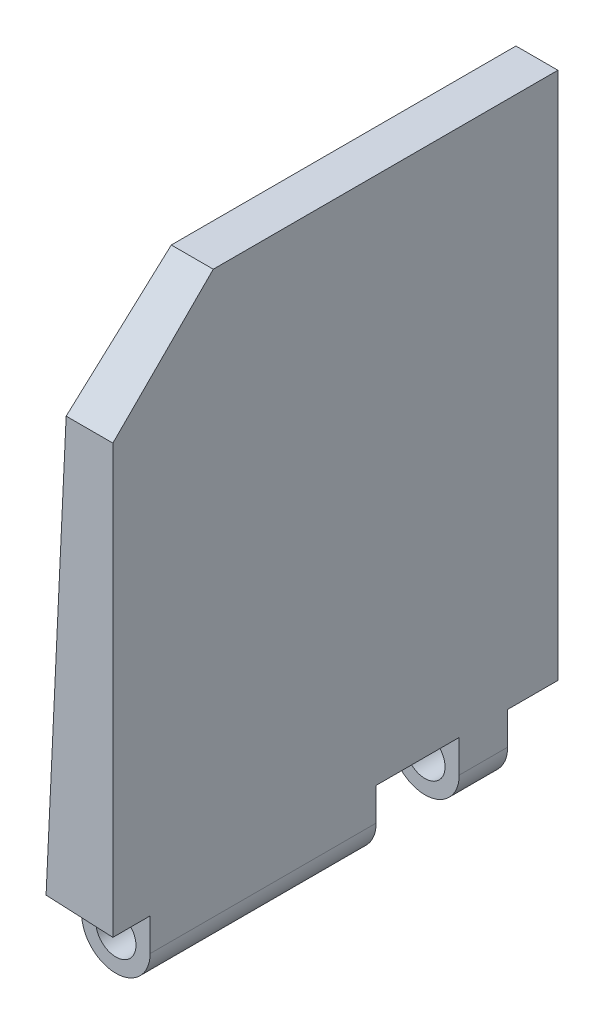
ISO-10303-21;
HEADER;
FILE_DESCRIPTION(('STEP AP214'),'2;1');
FILE_NAME('part.step','',(''),(''),'','','');
FILE_SCHEMA(('AUTOMOTIVE_DESIGN { 1 0 10303 214 1 1 1 1 }'));
ENDSEC;
DATA;
#1=APPLICATION_CONTEXT('core data for automotive mechanical design processes');
#2=APPLICATION_PROTOCOL_DEFINITION('international standard','automotive_design',2000,#1);
#3=PRODUCT_CONTEXT('',#1,'mechanical');
#4=PRODUCT('Part','Part','',(#3));
#5=PRODUCT_RELATED_PRODUCT_CATEGORY('part','',(#4));
#6=PRODUCT_DEFINITION_FORMATION('','',#4);
#7=PRODUCT_DEFINITION_CONTEXT('part definition',#1,'design');
#8=PRODUCT_DEFINITION('design','',#6,#7);
#9=PRODUCT_DEFINITION_SHAPE('','',#8);
#10=(LENGTH_UNIT() NAMED_UNIT(*) SI_UNIT(.MILLI.,.METRE.));
#11=(NAMED_UNIT(*) PLANE_ANGLE_UNIT() SI_UNIT($,.RADIAN.));
#12=(NAMED_UNIT(*) SI_UNIT($,.STERADIAN.) SOLID_ANGLE_UNIT());
#13=UNCERTAINTY_MEASURE_WITH_UNIT(LENGTH_MEASURE(1.E-05),#10,'distance_accuracy_value','');
#14=(GEOMETRIC_REPRESENTATION_CONTEXT(3) GLOBAL_UNCERTAINTY_ASSIGNED_CONTEXT((#13)) GLOBAL_UNIT_ASSIGNED_CONTEXT((#10,
#11,#12)) REPRESENTATION_CONTEXT('',''));
#15=CARTESIAN_POINT('',(0.,0.,0.));
#16=DIRECTION('',(0.,0.,1.));
#17=DIRECTION('',(1.,0.,0.));
#18=AXIS2_PLACEMENT_3D('',#15,#16,#17);
#19=CARTESIAN_POINT('',(-5.9368100641537,148.296821956492,-22.52));
#20=DIRECTION('',(0.,0.,1.));
#21=DIRECTION('',(1.,0.,0.));
#22=AXIS2_PLACEMENT_3D('',#19,#20,#21);
#23=CYLINDRICAL_SURFACE('',#22,1.73219883235693);
#24=CARTESIAN_POINT('',(-5.9368100641537,148.296821956492,-13.3230511202348));
#25=DIRECTION('',(0.,0.,1.));
#26=DIRECTION('',(1.,0.,0.));
#27=AXIS2_PLACEMENT_3D('',#24,#25,#26);
#28=CIRCLE('',#27,1.73219883235693);
#29=CARTESIAN_POINT('',(-4.20461123179677,148.296821956492,-13.3230511202348));
#30=VERTEX_POINT('',#29);
#31=CARTESIAN_POINT('',(-7.66707712949073,148.378606291354,-13.3230511202348));
#32=VERTEX_POINT('',#31);
#33=EDGE_CURVE('E165',#30,#32,#28,.F.);
#34=ORIENTED_EDGE('',*,*,#33,.F.);
#35=DIRECTION('',(0.,0.,1.));
#36=VECTOR('',#35,1.);
#37=CARTESIAN_POINT('',(-4.20461123179677,148.296821956492,-22.52));
#38=LINE('',#37,#36);
#39=CARTESIAN_POINT('',(-4.20461123179677,148.296821956492,-1.88465948900609));
#40=VERTEX_POINT('',#39);
#41=EDGE_CURVE('E192',#30,#40,#38,.T.);
#42=ORIENTED_EDGE('',*,*,#41,.T.);
#43=CARTESIAN_POINT('',(-5.9368100641537,148.296821956492,-1.88465948900609));
#44=DIRECTION('',(0.,0.,-1.));
#45=DIRECTION('',(0.,1.,0.));
#46=AXIS2_PLACEMENT_3D('',#43,#44,#45);
#47=CIRCLE('',#46,1.73219883235693);
#48=CARTESIAN_POINT('',(-7.66707712949073,148.378606291354,-1.88465948900609));
#49=VERTEX_POINT('',#48);
#50=EDGE_CURVE('E181',#49,#40,#47,.F.);
#51=ORIENTED_EDGE('',*,*,#50,.F.);
#52=DIRECTION('',(0.,0.,1.));
#53=VECTOR('',#52,1.);
#54=CARTESIAN_POINT('',(-7.66707712949072,148.378606291354,-22.52));
#55=LINE('',#54,#53);
#56=EDGE_CURVE('E199',#32,#49,#55,.T.);
#57=ORIENTED_EDGE('',*,*,#56,.F.);
#58=EDGE_LOOP('',(#34,#42,#51,#57));
#59=FACE_BOUND('',#58,.T.);
#60=ADVANCED_FACE('F32',(#59),#23,.T.);
#61=CARTESIAN_POINT('',(-5.9368100641537,148.296821956492,-19.9768142277735));
#62=DIRECTION('',(0.,0.,1.));
#63=DIRECTION('',(1.,0.,0.));
#64=AXIS2_PLACEMENT_3D('',#61,#62,#63);
#65=CIRCLE('',#64,1.73219883235693);
#66=CARTESIAN_POINT('',(-4.20461123179677,148.296821956492,-19.9768142277735));
#67=VERTEX_POINT('',#66);
#68=CARTESIAN_POINT('',(-7.66707712949073,148.378606291354,-19.9768142277735));
#69=VERTEX_POINT('',#68);
#70=EDGE_CURVE('E140',#67,#69,#65,.F.);
#71=ORIENTED_EDGE('',*,*,#70,.F.);
#72=CARTESIAN_POINT('',(-4.20461123179677,148.296821956492,-17.5249092704821));
#73=VERTEX_POINT('',#72);
#74=EDGE_CURVE('E204',#67,#73,#38,.T.);
#75=ORIENTED_EDGE('',*,*,#74,.T.);
#76=CARTESIAN_POINT('',(-5.9368100641537,148.296821956492,-17.5249092704821));
#77=DIRECTION('',(0.,0.,-1.));
#78=DIRECTION('',(-1.,0.,0.));
#79=AXIS2_PLACEMENT_3D('',#76,#77,#78);
#80=CIRCLE('',#79,1.73219883235693);
#81=CARTESIAN_POINT('',(-7.66707712949073,148.378606291354,-17.5249092704821));
#82=VERTEX_POINT('',#81);
#83=EDGE_CURVE('E168',#82,#73,#80,.F.);
#84=ORIENTED_EDGE('',*,*,#83,.F.);
#85=EDGE_CURVE('E196',#69,#82,#55,.T.);
#86=ORIENTED_EDGE('',*,*,#85,.F.);
#87=EDGE_LOOP('',(#71,#75,#84,#86));
#88=FACE_BOUND('',#87,.T.);
#89=ADVANCED_FACE('F255',(#88),#23,.T.);
#90=CARTESIAN_POINT('',(-7.66707712949072,148.378606291354,-22.52));
#91=DIRECTION('',(-0.998884789099364,0.0472141727230132,0.));
#92=DIRECTION('',(-0.0472141727230132,-0.998884789099364,0.));
#93=AXIS2_PLACEMENT_3D('',#90,#91,#92);
#94=PLANE('',#93);
#95=DIRECTION('',(-0.0472141727230132,-0.998884789099364,0.));
#96=VECTOR('',#95,1.);
#97=CARTESIAN_POINT('',(-7.66707712949072,148.378606291354,0.));
#98=LINE('',#97,#96);
#99=CARTESIAN_POINT('',(-6.56899797373491,171.610074781681,0.));
#100=VERTEX_POINT('',#99);
#101=CARTESIAN_POINT('',(-7.58529279462923,150.108873356691,0.));
#102=VERTEX_POINT('',#101);
#103=EDGE_CURVE('E188',#100,#102,#98,.T.);
#104=ORIENTED_EDGE('',*,*,#103,.F.);
#105=DIRECTION('',(0.0334040828032297,0.706712164622935,-0.70671216462294));
#106=VECTOR('',#105,1.);
#107=CARTESIAN_POINT('',(-6.58701893405534,171.228815043114,0.381259738567157));
#108=LINE('',#107,#106);
#109=CARTESIAN_POINT('',(-6.3288821965699,176.690074781681,-5.08000000000001));
#110=VERTEX_POINT('',#109);
#111=EDGE_CURVE('E54',#100,#110,#108,.T.);
#112=ORIENTED_EDGE('',*,*,#111,.T.);
#113=DIRECTION('',(0.,0.,1.));
#114=VECTOR('',#113,1.);
#115=CARTESIAN_POINT('',(-6.3288821965699,176.690074781681,-22.52));
#116=LINE('',#115,#114);
#117=CARTESIAN_POINT('',(-6.3288821965699,176.690074781681,-22.52));
#118=VERTEX_POINT('',#117);
#119=EDGE_CURVE('E200',#118,#110,#116,.T.);
#120=ORIENTED_EDGE('',*,*,#119,.F.);
#121=DIRECTION('',(-0.0472141727230132,-0.998884789099364,0.));
#122=VECTOR('',#121,1.);
#123=CARTESIAN_POINT('',(-7.66707712949072,148.378606291354,-22.52));
#124=LINE('',#123,#122);
#125=CARTESIAN_POINT('',(-7.58529279462922,150.108873356691,-22.52));
#126=VERTEX_POINT('',#125);
#127=EDGE_CURVE('E147',#118,#126,#124,.T.);
#128=ORIENTED_EDGE('',*,*,#127,.T.);
#129=DIRECTION('',(0.,0.,-1.));
#130=VECTOR('',#129,1.);
#131=CARTESIAN_POINT('',(-7.58529279462923,150.108873356691,-19.9768142277735));
#132=LINE('',#131,#130);
#133=CARTESIAN_POINT('',(-7.58529279462923,150.108873356691,-19.9768142277735));
#134=VERTEX_POINT('',#133);
#135=EDGE_CURVE('E129',#134,#126,#132,.T.);
#136=ORIENTED_EDGE('',*,*,#135,.F.);
#137=DIRECTION('',(0.0472141727230132,0.998884789099364,0.));
#138=VECTOR('',#137,1.);
#139=CARTESIAN_POINT('',(-7.74886146435224,146.648339226017,-19.9768142277735));
#140=LINE('',#139,#138);
#141=EDGE_CURVE('E138',#69,#134,#140,.T.);
#142=ORIENTED_EDGE('',*,*,#141,.F.);
#143=ORIENTED_EDGE('',*,*,#85,.T.);
#144=DIRECTION('',(-0.0472141727230132,-0.998884789099364,0.));
#145=VECTOR('',#144,1.);
#146=CARTESIAN_POINT('',(-7.74886146435224,146.648339226017,-17.5249092704821));
#147=LINE('',#146,#145);
#148=CARTESIAN_POINT('',(-7.58529279462923,150.108873356691,-17.5249092704821));
#149=VERTEX_POINT('',#148);
#150=EDGE_CURVE('E153',#149,#82,#147,.T.);
#151=ORIENTED_EDGE('',*,*,#150,.F.);
#152=DIRECTION('',(0.,0.,-1.));
#153=VECTOR('',#152,1.);
#154=CARTESIAN_POINT('',(-7.58529279462923,150.108873356691,-17.5249092704821));
#155=LINE('',#154,#153);
#156=CARTESIAN_POINT('',(-7.58529279462923,150.108873356691,-13.3230511202348));
#157=VERTEX_POINT('',#156);
#158=EDGE_CURVE('E159',#157,#149,#155,.T.);
#159=ORIENTED_EDGE('',*,*,#158,.F.);
#160=DIRECTION('',(0.0472141727230132,0.998884789099364,0.));
#161=VECTOR('',#160,1.);
#162=CARTESIAN_POINT('',(-7.74886146435224,146.648339226017,-13.3230511202348));
#163=LINE('',#162,#161);
#164=EDGE_CURVE('E156',#32,#157,#163,.T.);
#165=ORIENTED_EDGE('',*,*,#164,.F.);
#166=ORIENTED_EDGE('',*,*,#56,.T.);
#167=DIRECTION('',(-0.0472141727230132,-0.998884789099364,0.));
#168=VECTOR('',#167,1.);
#169=CARTESIAN_POINT('',(-7.74886146435224,146.648339226017,-1.88465948900609));
#170=LINE('',#169,#168);
#171=CARTESIAN_POINT('',(-7.58529279462923,150.108873356691,-1.88465948900609));
#172=VERTEX_POINT('',#171);
#173=EDGE_CURVE('E171',#172,#49,#170,.T.);
#174=ORIENTED_EDGE('',*,*,#173,.F.);
#175=DIRECTION('',(0.,0.,-1.));
#176=VECTOR('',#175,1.);
#177=CARTESIAN_POINT('',(-7.58529279462923,150.108873356691,-1.88465948900609));
#178=LINE('',#177,#176);
#179=EDGE_CURVE('E174',#102,#172,#178,.T.);
#180=ORIENTED_EDGE('',*,*,#179,.F.);
#181=EDGE_LOOP('',(#104,#112,#120,#128,#136,#142,#143,#151,#159,#165,#166,#174,#180));
#182=FACE_BOUND('',#181,.T.);
#183=ADVANCED_FACE('F145',(#182),#94,.T.);
#184=CARTESIAN_POINT('',(-6.3288821965699,176.690074781681,-22.52));
#185=DIRECTION('',(0.,1.,0.));
#186=DIRECTION('',(0.,0.,1.));
#187=AXIS2_PLACEMENT_3D('',#184,#185,#186);
#188=PLANE('',#187);
#189=ORIENTED_EDGE('',*,*,#119,.T.);
#190=DIRECTION('',(1.,0.,0.));
#191=VECTOR('',#190,1.);
#192=CARTESIAN_POINT('',(-4.20461123179677,176.690074781681,-5.08000000000001));
#193=LINE('',#192,#191);
#194=CARTESIAN_POINT('',(-4.20461123179677,176.690074781681,-5.08000000000003));
#195=VERTEX_POINT('',#194);
#196=EDGE_CURVE('E40',#110,#195,#193,.T.);
#197=ORIENTED_EDGE('',*,*,#196,.T.);
#198=DIRECTION('',(0.,0.,1.));
#199=VECTOR('',#198,1.);
#200=CARTESIAN_POINT('',(-4.20461123179677,176.690074781681,-22.52));
#201=LINE('',#200,#199);
#202=CARTESIAN_POINT('',(-4.20461123179677,176.690074781681,-22.52));
#203=VERTEX_POINT('',#202);
#204=EDGE_CURVE('E202',#203,#195,#201,.T.);
#205=ORIENTED_EDGE('',*,*,#204,.F.);
#206=DIRECTION('',(-1.,0.,0.));
#207=VECTOR('',#206,1.);
#208=CARTESIAN_POINT('',(-6.3288821965699,176.690074781681,-22.52));
#209=LINE('',#208,#207);
#210=EDGE_CURVE('E187',#203,#118,#209,.T.);
#211=ORIENTED_EDGE('',*,*,#210,.T.);
#212=EDGE_LOOP('',(#189,#197,#205,#211));
#213=FACE_BOUND('',#212,.T.);
#214=ADVANCED_FACE('F265',(#213),#188,.T.);
#215=CARTESIAN_POINT('',(-4.20461123179677,176.690074781681,-22.52));
#216=DIRECTION('',(1.,0.,0.));
#217=DIRECTION('',(0.,0.,-1.));
#218=AXIS2_PLACEMENT_3D('',#215,#216,#217);
#219=PLANE('',#218);
#220=ORIENTED_EDGE('',*,*,#204,.T.);
#221=DIRECTION('',(0.,-0.707106781186545,0.70710678118655));
#222=VECTOR('',#221,1.);
#223=CARTESIAN_POINT('',(-4.20461123179677,185.410074781681,-13.8000000000001));
#224=LINE('',#223,#222);
#225=CARTESIAN_POINT('',(-4.20461123179677,171.610074781681,0.));
#226=VERTEX_POINT('',#225);
#227=EDGE_CURVE('E11',#195,#226,#224,.T.);
#228=ORIENTED_EDGE('',*,*,#227,.T.);
#229=DIRECTION('',(0.,1.,0.));
#230=VECTOR('',#229,1.);
#231=CARTESIAN_POINT('',(-4.20461123179677,176.690074781681,0.));
#232=LINE('',#231,#230);
#233=CARTESIAN_POINT('',(-4.20461123179677,149.94907906913,0.));
#234=VERTEX_POINT('',#233);
#235=EDGE_CURVE('E184',#234,#226,#232,.T.);
#236=ORIENTED_EDGE('',*,*,#235,.F.);
#237=DIRECTION('',(0.,0.,1.));
#238=VECTOR('',#237,1.);
#239=CARTESIAN_POINT('',(-4.20461123179677,149.94907906913,-22.52));
#240=LINE('',#239,#238);
#241=CARTESIAN_POINT('',(-4.20461123179677,149.94907906913,-1.88465948900609));
#242=VERTEX_POINT('',#241);
#243=EDGE_CURVE('E179',#242,#234,#240,.T.);
#244=ORIENTED_EDGE('',*,*,#243,.F.);
#245=DIRECTION('',(0.,1.,0.));
#246=VECTOR('',#245,1.);
#247=CARTESIAN_POINT('',(-4.20461123179677,176.690074781681,-1.8846594890061));
#248=LINE('',#247,#246);
#249=EDGE_CURVE('E208',#40,#242,#248,.T.);
#250=ORIENTED_EDGE('',*,*,#249,.F.);
#251=ORIENTED_EDGE('',*,*,#41,.F.);
#252=DIRECTION('',(0.,-1.,0.));
#253=VECTOR('',#252,1.);
#254=CARTESIAN_POINT('',(-4.20461123179677,176.690074781681,-13.3230511202348));
#255=LINE('',#254,#253);
#256=CARTESIAN_POINT('',(-4.20461123179677,149.94907906913,-13.3230511202348));
#257=VERTEX_POINT('',#256);
#258=EDGE_CURVE('E210',#257,#30,#255,.T.);
#259=ORIENTED_EDGE('',*,*,#258,.F.);
#260=DIRECTION('',(0.,0.,1.));
#261=VECTOR('',#260,1.);
#262=CARTESIAN_POINT('',(-4.20461123179677,149.94907906913,-22.52));
#263=LINE('',#262,#261);
#264=CARTESIAN_POINT('',(-4.20461123179677,149.94907906913,-17.5249092704821));
#265=VERTEX_POINT('',#264);
#266=EDGE_CURVE('E213',#265,#257,#263,.T.);
#267=ORIENTED_EDGE('',*,*,#266,.F.);
#268=DIRECTION('',(0.,1.,0.));
#269=VECTOR('',#268,1.);
#270=CARTESIAN_POINT('',(-4.20461123179677,176.690074781681,-17.5249092704821));
#271=LINE('',#270,#269);
#272=EDGE_CURVE('E216',#73,#265,#271,.T.);
#273=ORIENTED_EDGE('',*,*,#272,.F.);
#274=ORIENTED_EDGE('',*,*,#74,.F.);
#275=DIRECTION('',(0.,-1.,0.));
#276=VECTOR('',#275,1.);
#277=CARTESIAN_POINT('',(-4.20461123179677,176.690074781681,-19.9768142277735));
#278=LINE('',#277,#276);
#279=CARTESIAN_POINT('',(-4.20461123179677,149.94907906913,-19.9768142277735));
#280=VERTEX_POINT('',#279);
#281=EDGE_CURVE('E220',#280,#67,#278,.T.);
#282=ORIENTED_EDGE('',*,*,#281,.F.);
#283=DIRECTION('',(0.,0.,1.));
#284=VECTOR('',#283,1.);
#285=CARTESIAN_POINT('',(-4.20461123179677,149.94907906913,-22.52));
#286=LINE('',#285,#284);
#287=CARTESIAN_POINT('',(-4.20461123179677,149.94907906913,-22.52));
#288=VERTEX_POINT('',#287);
#289=EDGE_CURVE('E132',#288,#280,#286,.T.);
#290=ORIENTED_EDGE('',*,*,#289,.F.);
#291=DIRECTION('',(0.,1.,0.));
#292=VECTOR('',#291,1.);
#293=CARTESIAN_POINT('',(-4.20461123179677,176.690074781681,-22.52));
#294=LINE('',#293,#292);
#295=EDGE_CURVE('E185',#288,#203,#294,.T.);
#296=ORIENTED_EDGE('',*,*,#295,.T.);
#297=EDGE_LOOP('',(#220,#228,#236,#244,#250,#251,#259,#267,#273,#274,#282,#290,#296));
#298=FACE_BOUND('',#297,.T.);
#299=ADVANCED_FACE('F244',(#298),#219,.T.);
#300=CARTESIAN_POINT('',(-5.9368100641537,148.296821956492,-22.52));
#301=DIRECTION('',(0.,0.,-1.));
#302=DIRECTION('',(-1.,0.,0.));
#303=AXIS2_PLACEMENT_3D('',#300,#301,#302);
#304=PLANE('',#303);
#305=DIRECTION('',(0.998884789099364,-0.0472141727230132,0.));
#306=VECTOR('',#305,1.);
#307=CARTESIAN_POINT('',(-5.8550257292922,150.027089021829,-22.52));
#308=LINE('',#307,#306);
#309=EDGE_CURVE('E218',#126,#288,#308,.T.);
#310=ORIENTED_EDGE('',*,*,#309,.F.);
#311=ORIENTED_EDGE('',*,*,#127,.F.);
#312=ORIENTED_EDGE('',*,*,#210,.F.);
#313=ORIENTED_EDGE('',*,*,#295,.F.);
#314=EDGE_LOOP('',(#310,#311,#312,#313));
#315=FACE_BOUND('',#314,.T.);
#316=ADVANCED_FACE('F264',(#315),#304,.T.);
#317=CARTESIAN_POINT('',(-5.9368100641537,148.296821956492,0.));
#318=DIRECTION('',(0.,0.,-1.));
#319=DIRECTION('',(-1.,0.,0.));
#320=AXIS2_PLACEMENT_3D('',#317,#318,#319);
#321=PLANE('',#320);
#322=ORIENTED_EDGE('',*,*,#235,.T.);
#323=DIRECTION('',(-1.,0.,0.));
#324=VECTOR('',#323,1.);
#325=CARTESIAN_POINT('',(-6.3288821965699,171.610074781681,0.));
#326=LINE('',#325,#324);
#327=EDGE_CURVE('E222',#226,#100,#326,.T.);
#328=ORIENTED_EDGE('',*,*,#327,.T.);
#329=ORIENTED_EDGE('',*,*,#103,.T.);
#330=DIRECTION('',(0.998884789099364,-0.0472141727230132,0.));
#331=VECTOR('',#330,1.);
#332=CARTESIAN_POINT('',(-5.8550257292922,150.027089021829,0.));
#333=LINE('',#332,#331);
#334=EDGE_CURVE('E198',#102,#234,#333,.T.);
#335=ORIENTED_EDGE('',*,*,#334,.T.);
#336=EDGE_LOOP('',(#322,#328,#329,#335));
#337=FACE_BOUND('',#336,.T.);
#338=ADVANCED_FACE('F232',(#337),#321,.F.);
#339=CARTESIAN_POINT('',(-4.2085638182907,146.481000383363,-1.88465948900609));
#340=DIRECTION('',(0.,0.,-1.));
#341=DIRECTION('',(0.,1.,0.));
#342=AXIS2_PLACEMENT_3D('',#339,#340,#341);
#343=PLANE('',#342);
#344=CARTESIAN_POINT('',(-5.9368100641537,148.296821956492,-1.88465948900607));
#345=DIRECTION('',(0.,0.,1.));
#346=DIRECTION('',(1.,0.,0.));
#347=AXIS2_PLACEMENT_3D('',#344,#345,#346);
#348=CIRCLE('',#347,1.01600000000001);
#349=CARTESIAN_POINT('',(-4.9208100641537,148.296821956492,-1.88465948900607));
#350=VERTEX_POINT('',#349);
#351=EDGE_CURVE('E227',#350,#350,#348,.T.);
#352=ORIENTED_EDGE('',*,*,#351,.F.);
#353=EDGE_LOOP('',(#352));
#354=FACE_BOUND('',#353,.T.);
#355=ORIENTED_EDGE('',*,*,#50,.T.);
#356=ORIENTED_EDGE('',*,*,#249,.T.);
#357=DIRECTION('',(-0.998884789099364,0.0472141727230132,0.));
#358=VECTOR('',#357,1.);
#359=CARTESIAN_POINT('',(-4.04499514856769,149.941534514037,-1.88465948900609));
#360=LINE('',#359,#358);
#361=EDGE_CURVE('E177',#242,#172,#360,.T.);
#362=ORIENTED_EDGE('',*,*,#361,.T.);
#363=ORIENTED_EDGE('',*,*,#173,.T.);
#364=EDGE_LOOP('',(#355,#356,#362,#363));
#365=FACE_BOUND('',#364,.T.);
#366=ADVANCED_FACE('F272',(#354,#365),#343,.F.);
#367=CARTESIAN_POINT('',(-4.04499514856769,149.941534514037,-1.88465948900609));
#368=DIRECTION('',(0.0472141727230132,0.998884789099364,0.));
#369=DIRECTION('',(-0.998884789099364,0.0472141727230132,0.));
#370=AXIS2_PLACEMENT_3D('',#367,#368,#369);
#371=PLANE('',#370);
#372=ORIENTED_EDGE('',*,*,#243,.T.);
#373=ORIENTED_EDGE('',*,*,#334,.F.);
#374=ORIENTED_EDGE('',*,*,#179,.T.);
#375=ORIENTED_EDGE('',*,*,#361,.F.);
#376=EDGE_LOOP('',(#372,#373,#374,#375));
#377=FACE_BOUND('',#376,.T.);
#378=ADVANCED_FACE('F241',(#377),#371,.F.);
#379=CARTESIAN_POINT('',(-4.2085638182907,146.481000383363,-17.5249092704821));
#380=DIRECTION('',(0.,0.,-1.));
#381=DIRECTION('',(-1.,0.,0.));
#382=AXIS2_PLACEMENT_3D('',#379,#380,#381);
#383=PLANE('',#382);
#384=CARTESIAN_POINT('',(-5.9368100641537,148.296821956492,-17.5249092704821));
#385=DIRECTION('',(0.,0.,-1.));
#386=DIRECTION('',(-1.,0.,0.));
#387=AXIS2_PLACEMENT_3D('',#384,#385,#386);
#388=CIRCLE('',#387,1.01600000000001);
#389=CARTESIAN_POINT('',(-4.9208100641537,148.296821956492,-17.5249092704821));
#390=VERTEX_POINT('',#389);
#391=EDGE_CURVE('E142',#390,#390,#388,.T.);
#392=ORIENTED_EDGE('',*,*,#391,.T.);
#393=EDGE_LOOP('',(#392));
#394=FACE_BOUND('',#393,.T.);
#395=ORIENTED_EDGE('',*,*,#83,.T.);
#396=ORIENTED_EDGE('',*,*,#272,.T.);
#397=DIRECTION('',(-0.998884789099364,0.0472141727230132,0.));
#398=VECTOR('',#397,1.);
#399=CARTESIAN_POINT('',(-4.04499514856769,149.941534514037,-17.5249092704821));
#400=LINE('',#399,#398);
#401=EDGE_CURVE('E163',#265,#149,#400,.T.);
#402=ORIENTED_EDGE('',*,*,#401,.T.);
#403=ORIENTED_EDGE('',*,*,#150,.T.);
#404=EDGE_LOOP('',(#395,#396,#402,#403));
#405=FACE_BOUND('',#404,.T.);
#406=ADVANCED_FACE('F281',(#394,#405),#383,.F.);
#407=CARTESIAN_POINT('',(-4.04499514856769,149.941534514037,-17.5249092704821));
#408=DIRECTION('',(0.0472141727230132,0.998884789099364,0.));
#409=DIRECTION('',(-0.998884789099364,0.0472141727230132,0.));
#410=AXIS2_PLACEMENT_3D('',#407,#408,#409);
#411=PLANE('',#410);
#412=ORIENTED_EDGE('',*,*,#266,.T.);
#413=DIRECTION('',(-0.998884789099364,0.0472141727230132,0.));
#414=VECTOR('',#413,1.);
#415=CARTESIAN_POINT('',(-4.04499514856769,149.941534514037,-13.3230511202348));
#416=LINE('',#415,#414);
#417=EDGE_CURVE('E162',#257,#157,#416,.T.);
#418=ORIENTED_EDGE('',*,*,#417,.T.);
#419=ORIENTED_EDGE('',*,*,#158,.T.);
#420=ORIENTED_EDGE('',*,*,#401,.F.);
#421=EDGE_LOOP('',(#412,#418,#419,#420));
#422=FACE_BOUND('',#421,.T.);
#423=ADVANCED_FACE('F284',(#422),#411,.F.);
#424=CARTESIAN_POINT('',(-4.2085638182907,146.481000383363,-13.3230511202348));
#425=DIRECTION('',(0.,0.,1.));
#426=DIRECTION('',(1.,0.,0.));
#427=AXIS2_PLACEMENT_3D('',#424,#425,#426);
#428=PLANE('',#427);
#429=CARTESIAN_POINT('',(-5.9368100641537,148.296821956492,-13.3230511202348));
#430=DIRECTION('',(0.,0.,1.));
#431=DIRECTION('',(1.,0.,0.));
#432=AXIS2_PLACEMENT_3D('',#429,#430,#431);
#433=CIRCLE('',#432,1.01600000000001);
#434=CARTESIAN_POINT('',(-4.9208100641537,148.296821956492,-13.3230511202348));
#435=VERTEX_POINT('',#434);
#436=EDGE_CURVE('E226',#435,#435,#433,.T.);
#437=ORIENTED_EDGE('',*,*,#436,.T.);
#438=EDGE_LOOP('',(#437));
#439=FACE_BOUND('',#438,.T.);
#440=ORIENTED_EDGE('',*,*,#33,.T.);
#441=ORIENTED_EDGE('',*,*,#164,.T.);
#442=ORIENTED_EDGE('',*,*,#417,.F.);
#443=ORIENTED_EDGE('',*,*,#258,.T.);
#444=EDGE_LOOP('',(#440,#441,#442,#443));
#445=FACE_BOUND('',#444,.T.);
#446=ADVANCED_FACE('F286',(#439,#445),#428,.F.);
#447=CARTESIAN_POINT('',(-4.2085638182907,146.481000383363,-19.9768142277735));
#448=DIRECTION('',(0.,0.,1.));
#449=DIRECTION('',(1.,0.,0.));
#450=AXIS2_PLACEMENT_3D('',#447,#448,#449);
#451=PLANE('',#450);
#452=CARTESIAN_POINT('',(-5.9368100641537,148.296821956492,-19.9768142277735));
#453=DIRECTION('',(0.,0.,1.));
#454=DIRECTION('',(1.,0.,0.));
#455=AXIS2_PLACEMENT_3D('',#452,#453,#454);
#456=CIRCLE('',#455,1.01600000000001);
#457=CARTESIAN_POINT('',(-4.9208100641537,148.296821956492,-19.9768142277735));
#458=VERTEX_POINT('',#457);
#459=EDGE_CURVE('E223',#458,#458,#456,.T.);
#460=ORIENTED_EDGE('',*,*,#459,.T.);
#461=EDGE_LOOP('',(#460));
#462=FACE_BOUND('',#461,.T.);
#463=ORIENTED_EDGE('',*,*,#70,.T.);
#464=ORIENTED_EDGE('',*,*,#141,.T.);
#465=DIRECTION('',(-0.998884789099364,0.0472141727230132,0.));
#466=VECTOR('',#465,1.);
#467=CARTESIAN_POINT('',(-4.04499514856769,149.941534514037,-19.9768142277735));
#468=LINE('',#467,#466);
#469=EDGE_CURVE('E125',#280,#134,#468,.T.);
#470=ORIENTED_EDGE('',*,*,#469,.F.);
#471=ORIENTED_EDGE('',*,*,#281,.T.);
#472=EDGE_LOOP('',(#463,#464,#470,#471));
#473=FACE_BOUND('',#472,.T.);
#474=ADVANCED_FACE('F139',(#462,#473),#451,.F.);
#475=CARTESIAN_POINT('',(-4.04499514856769,149.941534514037,-19.9768142277735));
#476=DIRECTION('',(0.0472141727230132,0.998884789099364,0.));
#477=DIRECTION('',(-0.998884789099364,0.0472141727230132,0.));
#478=AXIS2_PLACEMENT_3D('',#475,#476,#477);
#479=PLANE('',#478);
#480=ORIENTED_EDGE('',*,*,#289,.T.);
#481=ORIENTED_EDGE('',*,*,#469,.T.);
#482=ORIENTED_EDGE('',*,*,#135,.T.);
#483=ORIENTED_EDGE('',*,*,#309,.T.);
#484=EDGE_LOOP('',(#480,#481,#482,#483));
#485=FACE_BOUND('',#484,.T.);
#486=ADVANCED_FACE('F127',(#485),#479,.F.);
#487=CARTESIAN_POINT('',(-5.9368100641537,148.296821956492,-22.52));
#488=DIRECTION('',(0.,0.,1.));
#489=DIRECTION('',(1.,0.,0.));
#490=AXIS2_PLACEMENT_3D('',#487,#488,#489);
#491=CYLINDRICAL_SURFACE('',#490,1.01600000000001);
#492=CARTESIAN_POINT('',(-4.9208100641537,148.296821956492,-19.9768142277735));
#493=CARTESIAN_POINT('',(-4.9208100641537,148.296821956492,-19.9512735511351));
#494=CARTESIAN_POINT('',(-4.9208100641537,148.296821956492,-19.9257328744966));
#495=CARTESIAN_POINT('',(-4.9208100641537,148.296821956492,-19.8746515212197));
#496=CARTESIAN_POINT('',(-4.9208100641537,148.296821956492,-19.8491108445812));
#497=CARTESIAN_POINT('',(-4.9208100641537,148.296821956492,-19.7980294913043));
#498=CARTESIAN_POINT('',(-4.9208100641537,148.296821956492,-19.7724888146659));
#499=CARTESIAN_POINT('',(-4.9208100641537,148.296821956492,-19.721407461389));
#500=CARTESIAN_POINT('',(-4.9208100641537,148.296821956492,-19.6958667847505));
#501=CARTESIAN_POINT('',(-4.9208100641537,148.296821956492,-19.6447854314736));
#502=CARTESIAN_POINT('',(-4.9208100641537,148.296821956492,-19.6192447548352));
#503=CARTESIAN_POINT('',(-4.9208100641537,148.296821956492,-19.5681634015583));
#504=CARTESIAN_POINT('',(-4.9208100641537,148.296821956492,-19.5426227249198));
#505=CARTESIAN_POINT('',(-4.9208100641537,148.296821956492,-19.4915413716429));
#506=CARTESIAN_POINT('',(-4.9208100641537,148.296821956492,-19.4660006950045));
#507=CARTESIAN_POINT('',(-4.9208100641537,148.296821956492,-19.4149193417276));
#508=CARTESIAN_POINT('',(-4.9208100641537,148.296821956492,-19.3893786650891));
#509=CARTESIAN_POINT('',(-4.9208100641537,148.296821956492,-19.3382973118122));
#510=CARTESIAN_POINT('',(-4.9208100641537,148.296821956492,-19.3127566351737));
#511=CARTESIAN_POINT('',(-4.9208100641537,148.296821956492,-19.2616752818968));
#512=CARTESIAN_POINT('',(-4.9208100641537,148.296821956492,-19.2361346052584));
#513=CARTESIAN_POINT('',(-4.9208100641537,148.296821956492,-19.1850532519815));
#514=CARTESIAN_POINT('',(-4.9208100641537,148.296821956492,-19.159512575343));
#515=CARTESIAN_POINT('',(-4.9208100641537,148.296821956492,-19.1084312220661));
#516=CARTESIAN_POINT('',(-4.9208100641537,148.296821956492,-19.0828905454277));
#517=CARTESIAN_POINT('',(-4.9208100641537,148.296821956492,-19.0318091921508));
#518=CARTESIAN_POINT('',(-4.9208100641537,148.296821956492,-19.0062685155123));
#519=CARTESIAN_POINT('',(-4.9208100641537,148.296821956492,-18.9551871622354));
#520=CARTESIAN_POINT('',(-4.9208100641537,148.296821956492,-18.929646485597));
#521=CARTESIAN_POINT('',(-4.9208100641537,148.296821956492,-18.87856513232));
#522=CARTESIAN_POINT('',(-4.9208100641537,148.296821956492,-18.8530244556816));
#523=CARTESIAN_POINT('',(-4.9208100641537,148.296821956492,-18.8019431024047));
#524=CARTESIAN_POINT('',(-4.9208100641537,148.296821956492,-18.7764024257662));
#525=CARTESIAN_POINT('',(-4.9208100641537,148.296821956492,-18.7253210724893));
#526=CARTESIAN_POINT('',(-4.9208100641537,148.296821956492,-18.6997803958509));
#527=CARTESIAN_POINT('',(-4.9208100641537,148.296821956492,-18.648699042574));
#528=CARTESIAN_POINT('',(-4.9208100641537,148.296821956492,-18.6231583659355));
#529=CARTESIAN_POINT('',(-4.9208100641537,148.296821956492,-18.5720770126586));
#530=CARTESIAN_POINT('',(-4.9208100641537,148.296821956492,-18.5465363360202));
#531=CARTESIAN_POINT('',(-4.9208100641537,148.296821956492,-18.4954549827433));
#532=CARTESIAN_POINT('',(-4.9208100641537,148.296821956492,-18.4699143061048));
#533=CARTESIAN_POINT('',(-4.9208100641537,148.296821956492,-18.4188329528279));
#534=CARTESIAN_POINT('',(-4.9208100641537,148.296821956492,-18.3932922761894));
#535=CARTESIAN_POINT('',(-4.9208100641537,148.296821956492,-18.3422109229125));
#536=CARTESIAN_POINT('',(-4.9208100641537,148.296821956492,-18.3166702462741));
#537=CARTESIAN_POINT('',(-4.9208100641537,148.296821956492,-18.2655888929972));
#538=CARTESIAN_POINT('',(-4.9208100641537,148.296821956492,-18.2400482163587));
#539=CARTESIAN_POINT('',(-4.9208100641537,148.296821956492,-18.1889668630818));
#540=CARTESIAN_POINT('',(-4.9208100641537,148.296821956492,-18.1634261864434));
#541=CARTESIAN_POINT('',(-4.9208100641537,148.296821956492,-18.1123448331665));
#542=CARTESIAN_POINT('',(-4.9208100641537,148.296821956492,-18.086804156528));
#543=CARTESIAN_POINT('',(-4.9208100641537,148.296821956492,-18.0357228032511));
#544=CARTESIAN_POINT('',(-4.9208100641537,148.296821956492,-18.0101821266127));
#545=CARTESIAN_POINT('',(-4.9208100641537,148.296821956492,-17.9591007733358));
#546=CARTESIAN_POINT('',(-4.9208100641537,148.296821956492,-17.9335600966973));
#547=CARTESIAN_POINT('',(-4.9208100641537,148.296821956492,-17.8824787434204));
#548=CARTESIAN_POINT('',(-4.9208100641537,148.296821956492,-17.8569380667819));
#549=CARTESIAN_POINT('',(-4.9208100641537,148.296821956492,-17.805856713505));
#550=CARTESIAN_POINT('',(-4.9208100641537,148.296821956492,-17.7803160368666));
#551=CARTESIAN_POINT('',(-4.9208100641537,148.296821956492,-17.7292346835897));
#552=CARTESIAN_POINT('',(-4.9208100641537,148.296821956492,-17.7036940069512));
#553=CARTESIAN_POINT('',(-4.9208100641537,148.296821956492,-17.6526126536743));
#554=CARTESIAN_POINT('',(-4.9208100641537,148.296821956492,-17.6270719770359));
#555=CARTESIAN_POINT('',(-4.9208100641537,148.296821956492,-17.575990623759));
#556=CARTESIAN_POINT('',(-4.9208100641537,148.296821956492,-17.5504499471205));
#557=CARTESIAN_POINT('',(-4.9208100641537,148.296821956492,-17.5249092704821));
#558=B_SPLINE_CURVE_WITH_KNOTS('',3,(#492,#493,#494,#495,#496,#497,#498,#499,#500,#501,#502,
#503,#504,#505,#506,#507,#508,#509,#510,#511,#512,#513,#514,#515,#516,#517,#518,#519,#520,#521,
#522,#523,#524,#525,#526,#527,#528,#529,#530,#531,#532,#533,#534,#535,#536,#537,#538,#539,#540,
#541,#542,#543,#544,#545,#546,#547,#548,#549,#550,#551,#552,#553,#554,#555,#556,#557),
.UNSPECIFIED.,.F.,.F.,(4,2,2,2,2,2,2,2,2,2,2,2,2,2,2,2,2,2,2,2,2,2,2,2,2,2,2,2,2,2,2,2,4),(0.,
0.0766220299153603,0.153244059830717,0.229866089746077,0.306488119661434,0.383110149576791,
0.459732179492151,0.536354209407508,0.612976239322865,0.689598269238225,0.766220299153582,
0.842842329068939,0.919464358984299,0.996086388899656,1.07270841881501,1.14933044873037,
1.22595247864573,1.30257450856109,1.37919653847645,1.4558185683918,1.53244059830716,
1.60906262822252,1.68568465813788,1.76230668805323,1.83892871796859,1.91555074788395,
1.99217277779931,2.06879480771467,2.14541683763002,2.22203886754539,2.29866089746074,
2.3752829273761,2.45190495729146),.UNSPECIFIED.);
#559=EDGE_CURVE('BSEAM251',#458,#390,#558,.T.);
#560=ORIENTED_EDGE('',*,*,#459,.F.);
#561=ORIENTED_EDGE('',*,*,#391,.F.);
#562=ORIENTED_EDGE('',*,*,#559,.T.);
#563=ORIENTED_EDGE('',*,*,#559,.F.);
#564=EDGE_LOOP('',(#560,#562,#561,#563));
#565=FACE_BOUND('',#564,.T.);
#566=ADVANCED_FACE('F251',(#565),#491,.F.);
#567=CARTESIAN_POINT('',(-4.9208100641537,148.296821956492,-1.88465948900607));
#568=CARTESIAN_POINT('',(-4.9208100641537,148.296821956492,-2.00380940183137));
#569=CARTESIAN_POINT('',(-4.9208100641537,148.296821956492,-2.12295931465667));
#570=CARTESIAN_POINT('',(-4.9208100641537,148.296821956492,-2.36125914030727));
#571=CARTESIAN_POINT('',(-4.9208100641537,148.296821956492,-2.48040905313257));
#572=CARTESIAN_POINT('',(-4.9208100641537,148.296821956492,-2.71870887878317));
#573=CARTESIAN_POINT('',(-4.9208100641537,148.296821956492,-2.83785879160847));
#574=CARTESIAN_POINT('',(-4.9208100641537,148.296821956492,-3.07615861725906));
#575=CARTESIAN_POINT('',(-4.9208100641537,148.296821956492,-3.19530853008436));
#576=CARTESIAN_POINT('',(-4.9208100641537,148.296821956492,-3.43360835573496));
#577=CARTESIAN_POINT('',(-4.9208100641537,148.296821956492,-3.55275826856026));
#578=CARTESIAN_POINT('',(-4.9208100641537,148.296821956492,-3.79105809421086));
#579=CARTESIAN_POINT('',(-4.9208100641537,148.296821956492,-3.91020800703616));
#580=CARTESIAN_POINT('',(-4.9208100641537,148.296821956492,-4.14850783268676));
#581=CARTESIAN_POINT('',(-4.9208100641537,148.296821956492,-4.26765774551206));
#582=CARTESIAN_POINT('',(-4.9208100641537,148.296821956492,-4.50595757116265));
#583=CARTESIAN_POINT('',(-4.9208100641537,148.296821956492,-4.62510748398795));
#584=CARTESIAN_POINT('',(-4.9208100641537,148.296821956492,-4.86340730963855));
#585=CARTESIAN_POINT('',(-4.9208100641537,148.296821956492,-4.98255722246385));
#586=CARTESIAN_POINT('',(-4.9208100641537,148.296821956492,-5.22085704811445));
#587=CARTESIAN_POINT('',(-4.9208100641537,148.296821956492,-5.34000696093975));
#588=CARTESIAN_POINT('',(-4.9208100641537,148.296821956492,-5.57830678659035));
#589=CARTESIAN_POINT('',(-4.9208100641537,148.296821956492,-5.69745669941564));
#590=CARTESIAN_POINT('',(-4.9208100641537,148.296821956492,-5.93575652506624));
#591=CARTESIAN_POINT('',(-4.9208100641537,148.296821956492,-6.05490643789154));
#592=CARTESIAN_POINT('',(-4.9208100641537,148.296821956492,-6.29320626354214));
#593=CARTESIAN_POINT('',(-4.9208100641537,148.296821956492,-6.41235617636744));
#594=CARTESIAN_POINT('',(-4.9208100641537,148.296821956492,-6.65065600201804));
#595=CARTESIAN_POINT('',(-4.9208100641537,148.296821956492,-6.76980591484334));
#596=CARTESIAN_POINT('',(-4.9208100641537,148.296821956492,-7.00810574049394));
#597=CARTESIAN_POINT('',(-4.9208100641537,148.296821956492,-7.12725565331923));
#598=CARTESIAN_POINT('',(-4.9208100641537,148.296821956492,-7.36555547896983));
#599=CARTESIAN_POINT('',(-4.9208100641537,148.296821956492,-7.48470539179513));
#600=CARTESIAN_POINT('',(-4.9208100641537,148.296821956492,-7.72300521744573));
#601=CARTESIAN_POINT('',(-4.9208100641537,148.296821956492,-7.84215513027103));
#602=CARTESIAN_POINT('',(-4.9208100641537,148.296821956492,-8.08045495592163));
#603=CARTESIAN_POINT('',(-4.9208100641537,148.296821956492,-8.19960486874692));
#604=CARTESIAN_POINT('',(-4.9208100641537,148.296821956492,-8.43790469439752));
#605=CARTESIAN_POINT('',(-4.9208100641537,148.296821956492,-8.55705460722282));
#606=CARTESIAN_POINT('',(-4.9208100641537,148.296821956492,-8.79535443287342));
#607=CARTESIAN_POINT('',(-4.9208100641537,148.296821956492,-8.91450434569872));
#608=CARTESIAN_POINT('',(-4.9208100641537,148.296821956492,-9.15280417134932));
#609=CARTESIAN_POINT('',(-4.9208100641537,148.296821956492,-9.27195408417462));
#610=CARTESIAN_POINT('',(-4.9208100641537,148.296821956492,-9.51025390982521));
#611=CARTESIAN_POINT('',(-4.9208100641537,148.296821956492,-9.62940382265051));
#612=CARTESIAN_POINT('',(-4.9208100641537,148.296821956492,-9.86770364830111));
#613=CARTESIAN_POINT('',(-4.9208100641537,148.296821956492,-9.98685356112641));
#614=CARTESIAN_POINT('',(-4.9208100641537,148.296821956492,-10.225153386777));
#615=CARTESIAN_POINT('',(-4.9208100641537,148.296821956492,-10.3443032996023));
#616=CARTESIAN_POINT('',(-4.9208100641537,148.296821956492,-10.5826031252529));
#617=CARTESIAN_POINT('',(-4.9208100641537,148.296821956492,-10.7017530380782));
#618=CARTESIAN_POINT('',(-4.9208100641537,148.296821956492,-10.9400528637288));
#619=CARTESIAN_POINT('',(-4.9208100641537,148.296821956492,-11.0592027765541));
#620=CARTESIAN_POINT('',(-4.9208100641537,148.296821956492,-11.2975026022047));
#621=CARTESIAN_POINT('',(-4.9208100641537,148.296821956492,-11.41665251503));
#622=CARTESIAN_POINT('',(-4.9208100641537,148.296821956492,-11.6549523406806));
#623=CARTESIAN_POINT('',(-4.9208100641537,148.296821956492,-11.7741022535059));
#624=CARTESIAN_POINT('',(-4.9208100641537,148.296821956492,-12.0124020791565));
#625=CARTESIAN_POINT('',(-4.9208100641537,148.296821956492,-12.1315519919818));
#626=CARTESIAN_POINT('',(-4.9208100641537,148.296821956492,-12.3698518176324));
#627=CARTESIAN_POINT('',(-4.9208100641537,148.296821956492,-12.4890017304577));
#628=CARTESIAN_POINT('',(-4.9208100641537,148.296821956492,-12.7273015561083));
#629=CARTESIAN_POINT('',(-4.9208100641537,148.296821956492,-12.8464514689336));
#630=CARTESIAN_POINT('',(-4.9208100641537,148.296821956492,-13.0847512945842));
#631=CARTESIAN_POINT('',(-4.9208100641537,148.296821956492,-13.2039012074095));
#632=CARTESIAN_POINT('',(-4.9208100641537,148.296821956492,-13.3230511202348));
#633=B_SPLINE_CURVE_WITH_KNOTS('',3,(#567,#568,#569,#570,#571,#572,#573,#574,#575,#576,#577,
#578,#579,#580,#581,#582,#583,#584,#585,#586,#587,#588,#589,#590,#591,#592,#593,#594,#595,#596,
#597,#598,#599,#600,#601,#602,#603,#604,#605,#606,#607,#608,#609,#610,#611,#612,#613,#614,#615,
#616,#617,#618,#619,#620,#621,#622,#623,#624,#625,#626,#627,#628,#629,#630,#631,#632),
.UNSPECIFIED.,.F.,.F.,(4,2,2,2,2,2,2,2,2,2,2,2,2,2,2,2,2,2,2,2,2,2,2,2,2,2,2,2,2,2,2,2,4),(0.,
0.357449738475898,0.714899476951796,1.07234921542769,1.42979895390359,1.78724869237949,
2.14469843085539,2.50214816933128,2.85959790780718,3.21704764628308,3.57449738475897,
3.93194712323487,4.28939686171077,4.64684660018667,5.00429633866256,5.36174607713846,
5.71919581561436,6.07664555409025,6.43409529256615,6.79154503104205,7.14899476951795,
7.50644450799384,7.86389424646974,8.22134398494564,8.57879372342154,8.93624346189743,
9.29369320037333,9.65114293884923,10.0085926773251,10.366042415801,10.7234921542769,
11.0809418927528,11.4383916312287),.UNSPECIFIED.);
#634=EDGE_CURVE('BSEAM247',#350,#435,#633,.T.);
#635=ORIENTED_EDGE('',*,*,#351,.T.);
#636=ORIENTED_EDGE('',*,*,#436,.F.);
#637=ORIENTED_EDGE('',*,*,#634,.T.);
#638=ORIENTED_EDGE('',*,*,#634,.F.);
#639=EDGE_LOOP('',(#635,#637,#636,#638));
#640=FACE_BOUND('',#639,.T.);
#641=ADVANCED_FACE('F247',(#640),#491,.F.);
#642=CARTESIAN_POINT('',(-5.9368100641537,171.610074781681,0.));
#643=DIRECTION('',(0.,0.70710678118655,0.707106781186545));
#644=DIRECTION('',(0.,-0.707106781186545,0.70710678118655));
#645=AXIS2_PLACEMENT_3D('',#642,#643,#644);
#646=PLANE('',#645);
#647=ORIENTED_EDGE('',*,*,#227,.F.);
#648=ORIENTED_EDGE('',*,*,#196,.F.);
#649=ORIENTED_EDGE('',*,*,#111,.F.);
#650=ORIENTED_EDGE('',*,*,#327,.F.);
#651=EDGE_LOOP('',(#647,#648,#649,#650));
#652=FACE_BOUND('',#651,.T.);
#653=ADVANCED_FACE('F34',(#652),#646,.T.);
#654=CLOSED_SHELL('',(#60,#89,#183,#214,#299,#316,#338,#366,#378,#406,#423,#446,#474,#486,#566,
#641,#653));
#655=MANIFOLD_SOLID_BREP('B2',#654);
#656=ADVANCED_BREP_SHAPE_REPRESENTATION('',(#18,#655),#14);
#657=SHAPE_DEFINITION_REPRESENTATION(#9,#656);
ENDSEC;
END-ISO-10303-21;
